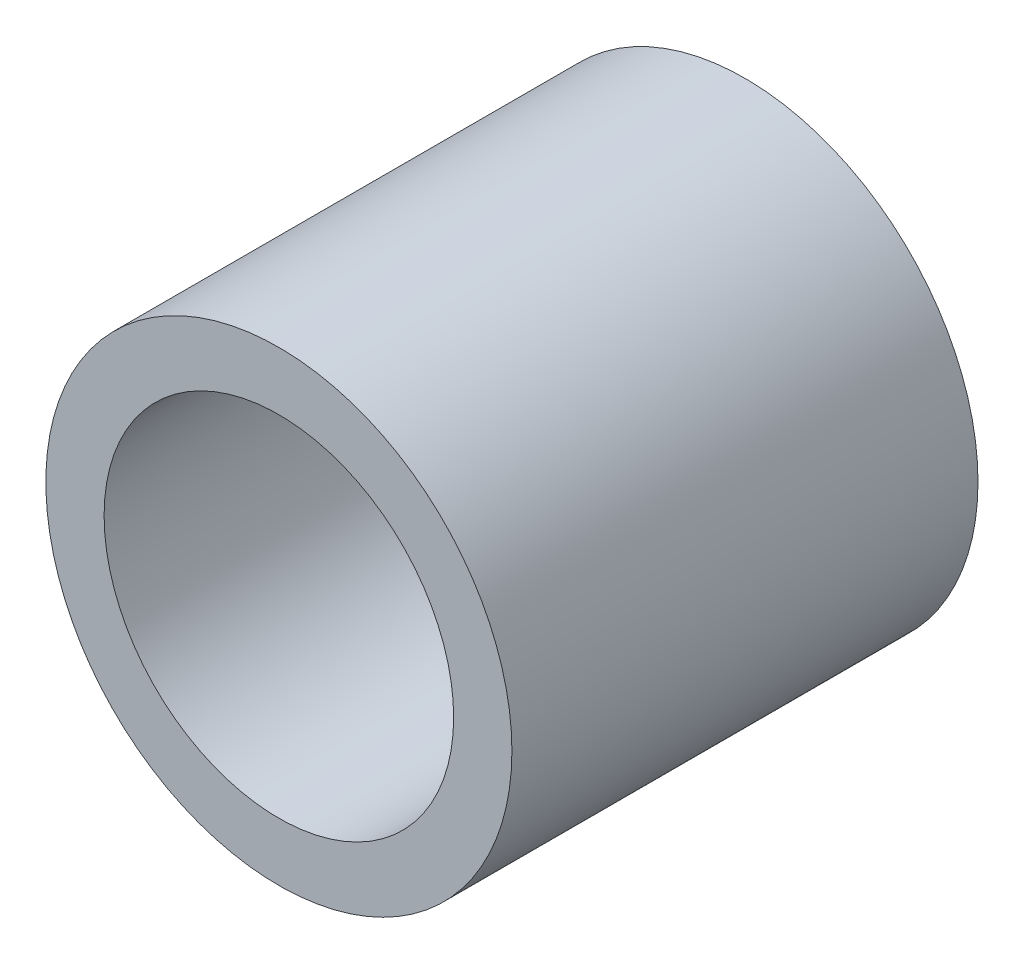
ISO-10303-21;
HEADER;
FILE_DESCRIPTION(('STEP AP214'),'2;1');
FILE_NAME('part.step','',(''),(''),'','','');
FILE_SCHEMA(('AUTOMOTIVE_DESIGN { 1 0 10303 214 1 1 1 1 }'));
ENDSEC;
DATA;
#1=APPLICATION_CONTEXT('core data for automotive mechanical design processes');
#2=APPLICATION_PROTOCOL_DEFINITION('international standard','automotive_design',2000,#1);
#3=PRODUCT_CONTEXT('',#1,'mechanical');
#4=PRODUCT('Part','Part','',(#3));
#5=PRODUCT_RELATED_PRODUCT_CATEGORY('part','',(#4));
#6=PRODUCT_DEFINITION_FORMATION('','',#4);
#7=PRODUCT_DEFINITION_CONTEXT('part definition',#1,'design');
#8=PRODUCT_DEFINITION('design','',#6,#7);
#9=PRODUCT_DEFINITION_SHAPE('','',#8);
#10=(LENGTH_UNIT() NAMED_UNIT(*) SI_UNIT(.MILLI.,.METRE.));
#11=(NAMED_UNIT(*) PLANE_ANGLE_UNIT() SI_UNIT($,.RADIAN.));
#12=(NAMED_UNIT(*) SI_UNIT($,.STERADIAN.) SOLID_ANGLE_UNIT());
#13=UNCERTAINTY_MEASURE_WITH_UNIT(LENGTH_MEASURE(1.E-05),#10,'distance_accuracy_value','');
#14=(GEOMETRIC_REPRESENTATION_CONTEXT(3) GLOBAL_UNCERTAINTY_ASSIGNED_CONTEXT((#13)) GLOBAL_UNIT_ASSIGNED_CONTEXT((#10,
#11,#12)) REPRESENTATION_CONTEXT('',''));
#15=CARTESIAN_POINT('',(0.,0.,0.));
#16=DIRECTION('',(0.,0.,1.));
#17=DIRECTION('',(1.,0.,0.));
#18=AXIS2_PLACEMENT_3D('',#15,#16,#17);
#19=CARTESIAN_POINT('',(0.,0.,12.7));
#20=DIRECTION('',(0.,0.,1.));
#21=DIRECTION('',(1.,0.,0.));
#22=AXIS2_PLACEMENT_3D('',#19,#20,#21);
#23=PLANE('',#22);
#24=CARTESIAN_POINT('',(0.,0.,12.7));
#25=DIRECTION('',(0.,0.,1.));
#26=DIRECTION('',(1.,0.,0.));
#27=AXIS2_PLACEMENT_3D('',#24,#25,#26);
#28=CIRCLE('',#27,6.35);
#29=CARTESIAN_POINT('',(6.35,0.,12.7));
#30=VERTEX_POINT('',#29);
#31=EDGE_CURVE('E9',#30,#30,#28,.T.);
#32=ORIENTED_EDGE('',*,*,#31,.T.);
#33=EDGE_LOOP('',(#32));
#34=FACE_BOUND('',#33,.T.);
#35=CARTESIAN_POINT('',(0.,0.,12.7));
#36=DIRECTION('',(0.,0.,1.));
#37=DIRECTION('',(1.,0.,0.));
#38=AXIS2_PLACEMENT_3D('',#35,#36,#37);
#39=CIRCLE('',#38,4.7625);
#40=CARTESIAN_POINT('',(4.7625,0.,12.7));
#41=VERTEX_POINT('',#40);
#42=EDGE_CURVE('E28',#41,#41,#39,.T.);
#43=ORIENTED_EDGE('',*,*,#42,.F.);
#44=EDGE_LOOP('',(#43));
#45=FACE_BOUND('',#44,.T.);
#46=ADVANCED_FACE('F14',(#34,#45),#23,.T.);
#47=CARTESIAN_POINT('',(0.,0.,0.));
#48=DIRECTION('',(0.,0.,1.));
#49=DIRECTION('',(1.,0.,0.));
#50=AXIS2_PLACEMENT_3D('',#47,#48,#49);
#51=PLANE('',#50);
#52=CARTESIAN_POINT('',(0.,0.,0.));
#53=DIRECTION('',(0.,0.,1.));
#54=DIRECTION('',(1.,0.,0.));
#55=AXIS2_PLACEMENT_3D('',#52,#53,#54);
#56=CIRCLE('',#55,6.35);
#57=CARTESIAN_POINT('',(6.35,0.,0.));
#58=VERTEX_POINT('',#57);
#59=EDGE_CURVE('E26',#58,#58,#56,.T.);
#60=ORIENTED_EDGE('',*,*,#59,.F.);
#61=EDGE_LOOP('',(#60));
#62=FACE_BOUND('',#61,.T.);
#63=CARTESIAN_POINT('',(0.,0.,0.));
#64=DIRECTION('',(0.,0.,1.));
#65=DIRECTION('',(1.,0.,0.));
#66=AXIS2_PLACEMENT_3D('',#63,#64,#65);
#67=CIRCLE('',#66,4.7625);
#68=CARTESIAN_POINT('',(4.7625,0.,0.));
#69=VERTEX_POINT('',#68);
#70=EDGE_CURVE('E18',#69,#69,#67,.T.);
#71=ORIENTED_EDGE('',*,*,#70,.T.);
#72=EDGE_LOOP('',(#71));
#73=FACE_BOUND('',#72,.T.);
#74=ADVANCED_FACE('F35',(#62,#73),#51,.F.);
#75=CARTESIAN_POINT('',(0.,0.,12.7));
#76=DIRECTION('',(0.,0.,-1.));
#77=DIRECTION('',(0.,-1.,0.));
#78=AXIS2_PLACEMENT_3D('',#75,#76,#77);
#79=CYLINDRICAL_SURFACE('',#78,6.35);
#80=ORIENTED_EDGE('',*,*,#31,.F.);
#81=EDGE_LOOP('',(#80));
#82=FACE_BOUND('',#81,.T.);
#83=ORIENTED_EDGE('',*,*,#59,.T.);
#84=EDGE_LOOP('',(#83));
#85=FACE_BOUND('',#84,.T.);
#86=ADVANCED_FACE('F33',(#82,#85),#79,.T.);
#87=CARTESIAN_POINT('',(0.,0.,12.7));
#88=DIRECTION('',(0.,0.,-1.));
#89=DIRECTION('',(0.,-1.,0.));
#90=AXIS2_PLACEMENT_3D('',#87,#88,#89);
#91=CYLINDRICAL_SURFACE('',#90,4.7625);
#92=ORIENTED_EDGE('',*,*,#42,.T.);
#93=EDGE_LOOP('',(#92));
#94=FACE_BOUND('',#93,.T.);
#95=ORIENTED_EDGE('',*,*,#70,.F.);
#96=EDGE_LOOP('',(#95));
#97=FACE_BOUND('',#96,.T.);
#98=ADVANCED_FACE('F16',(#94,#97),#91,.F.);
#99=CLOSED_SHELL('',(#46,#74,#86,#98));
#100=MANIFOLD_SOLID_BREP('B1',#99);
#101=ADVANCED_BREP_SHAPE_REPRESENTATION('',(#18,#100),#14);
#102=SHAPE_DEFINITION_REPRESENTATION(#9,#101);
ENDSEC;
END-ISO-10303-21;
